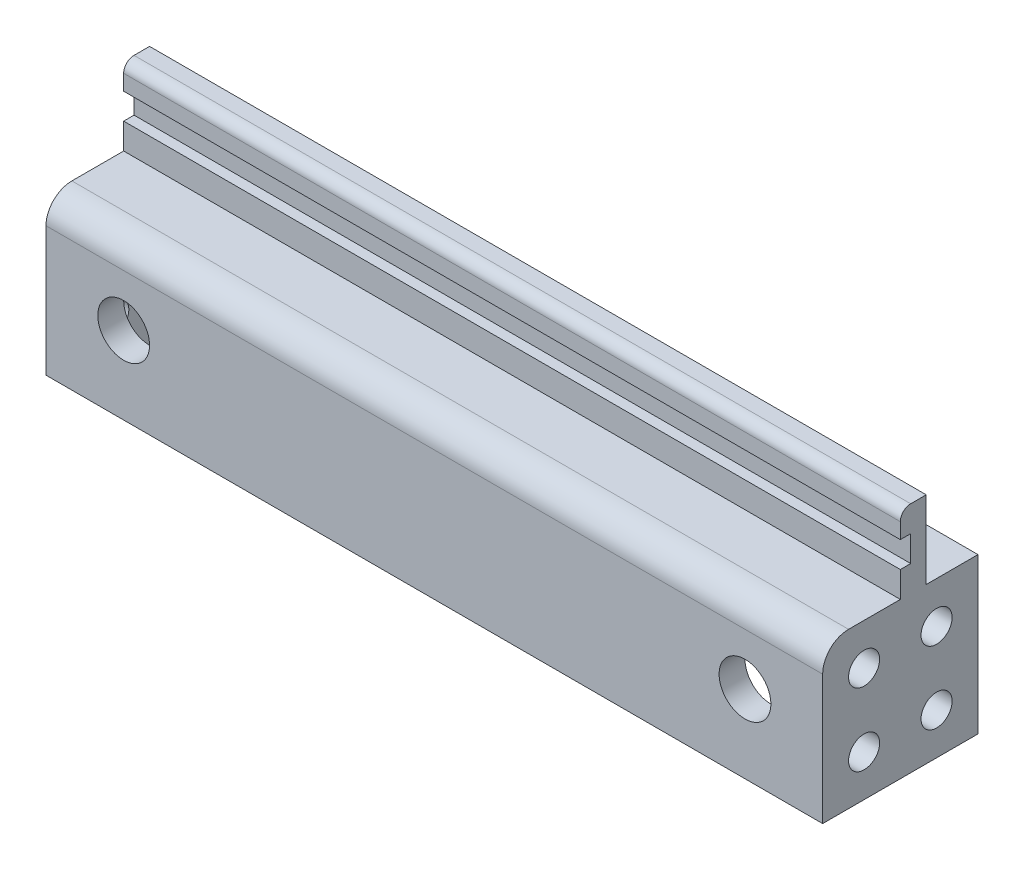
ISO-10303-21;
HEADER;
FILE_DESCRIPTION(('STEP AP214'),'2;1');
FILE_NAME('part.step','',(''),(''),'','','');
FILE_SCHEMA(('AUTOMOTIVE_DESIGN { 1 0 10303 214 1 1 1 1 }'));
ENDSEC;
DATA;
#1=APPLICATION_CONTEXT('core data for automotive mechanical design processes');
#2=APPLICATION_PROTOCOL_DEFINITION('international standard','automotive_design',2000,#1);
#3=PRODUCT_CONTEXT('',#1,'mechanical');
#4=PRODUCT('Part','Part','',(#3));
#5=PRODUCT_RELATED_PRODUCT_CATEGORY('part','',(#4));
#6=PRODUCT_DEFINITION_FORMATION('','',#4);
#7=PRODUCT_DEFINITION_CONTEXT('part definition',#1,'design');
#8=PRODUCT_DEFINITION('design','',#6,#7);
#9=PRODUCT_DEFINITION_SHAPE('','',#8);
#10=(LENGTH_UNIT() NAMED_UNIT(*) SI_UNIT(.MILLI.,.METRE.));
#11=(NAMED_UNIT(*) PLANE_ANGLE_UNIT() SI_UNIT($,.RADIAN.));
#12=(NAMED_UNIT(*) SI_UNIT($,.STERADIAN.) SOLID_ANGLE_UNIT());
#13=UNCERTAINTY_MEASURE_WITH_UNIT(LENGTH_MEASURE(1.E-05),#10,'distance_accuracy_value','');
#14=(GEOMETRIC_REPRESENTATION_CONTEXT(3) GLOBAL_UNCERTAINTY_ASSIGNED_CONTEXT((#13)) GLOBAL_UNIT_ASSIGNED_CONTEXT((#10,
#11,#12)) REPRESENTATION_CONTEXT('',''));
#15=CARTESIAN_POINT('',(0.,0.,0.));
#16=DIRECTION('',(0.,0.,1.));
#17=DIRECTION('',(1.,0.,0.));
#18=AXIS2_PLACEMENT_3D('',#15,#16,#17);
#19=CARTESIAN_POINT('',(-150.,45.,-15.));
#20=DIRECTION('',(0.,0.,-1.));
#21=DIRECTION('',(-1.,0.,0.));
#22=AXIS2_PLACEMENT_3D('',#19,#20,#21);
#23=PLANE('',#22);
#24=DIRECTION('',(0.,-1.,0.));
#25=VECTOR('',#24,1.);
#26=CARTESIAN_POINT('',(0.,45.,-15.));
#27=LINE('',#26,#25);
#28=CARTESIAN_POINT('',(0.,43.,-15.));
#29=VERTEX_POINT('',#28);
#30=CARTESIAN_POINT('',(0.,40.,-15.));
#31=VERTEX_POINT('',#30);
#32=EDGE_CURVE('E262',#29,#31,#27,.T.);
#33=ORIENTED_EDGE('',*,*,#32,.F.);
#34=DIRECTION('',(1.,0.,0.));
#35=VECTOR('',#34,1.);
#36=CARTESIAN_POINT('',(-150.,43.,-15.));
#37=LINE('',#36,#35);
#38=CARTESIAN_POINT('',(-150.,43.,-15.));
#39=VERTEX_POINT('',#38);
#40=EDGE_CURVE('E414',#29,#39,#37,.F.);
#41=ORIENTED_EDGE('',*,*,#40,.T.);
#42=DIRECTION('',(0.,-1.,0.));
#43=VECTOR('',#42,1.);
#44=CARTESIAN_POINT('',(-150.,45.,-15.));
#45=LINE('',#44,#43);
#46=CARTESIAN_POINT('',(-150.,40.,-15.));
#47=VERTEX_POINT('',#46);
#48=EDGE_CURVE('E264',#39,#47,#45,.T.);
#49=ORIENTED_EDGE('',*,*,#48,.T.);
#50=DIRECTION('',(-1.,0.,0.));
#51=VECTOR('',#50,1.);
#52=CARTESIAN_POINT('',(-150.,40.,-15.));
#53=LINE('',#52,#51);
#54=EDGE_CURVE('E229',#31,#47,#53,.T.);
#55=ORIENTED_EDGE('',*,*,#54,.F.);
#56=EDGE_LOOP('',(#33,#41,#49,#55));
#57=FACE_BOUND('',#56,.T.);
#58=ADVANCED_FACE('F51',(#57),#23,.F.);
#59=CARTESIAN_POINT('',(0.,30.,0.));
#60=DIRECTION('',(0.,-1.,0.));
#61=DIRECTION('',(0.,0.,-1.));
#62=AXIS2_PLACEMENT_3D('',#59,#60,#61);
#63=PLANE('',#62);
#64=DIRECTION('',(-1.,0.,0.));
#65=VECTOR('',#64,1.);
#66=CARTESIAN_POINT('',(-150.,30.,-20.));
#67=LINE('',#66,#65);
#68=CARTESIAN_POINT('',(0.,30.,-20.));
#69=VERTEX_POINT('',#68);
#70=CARTESIAN_POINT('',(-150.,30.,-20.));
#71=VERTEX_POINT('',#70);
#72=EDGE_CURVE('E245',#69,#71,#67,.T.);
#73=ORIENTED_EDGE('',*,*,#72,.F.);
#74=DIRECTION('',(0.,0.,-1.));
#75=VECTOR('',#74,1.);
#76=CARTESIAN_POINT('',(0.,30.,-30.));
#77=LINE('',#76,#75);
#78=CARTESIAN_POINT('',(0.,30.,-30.));
#79=VERTEX_POINT('',#78);
#80=EDGE_CURVE('E379',#69,#79,#77,.T.);
#81=ORIENTED_EDGE('',*,*,#80,.T.);
#82=DIRECTION('',(-1.,0.,0.));
#83=VECTOR('',#82,1.);
#84=CARTESIAN_POINT('',(-150.,30.,-30.));
#85=LINE('',#84,#83);
#86=CARTESIAN_POINT('',(-150.,30.,-30.));
#87=VERTEX_POINT('',#86);
#88=EDGE_CURVE('E378',#79,#87,#85,.T.);
#89=ORIENTED_EDGE('',*,*,#88,.T.);
#90=DIRECTION('',(0.,0.,1.));
#91=VECTOR('',#90,1.);
#92=CARTESIAN_POINT('',(-150.,30.,0.));
#93=LINE('',#92,#91);
#94=EDGE_CURVE('E382',#87,#71,#93,.T.);
#95=ORIENTED_EDGE('',*,*,#94,.T.);
#96=EDGE_LOOP('',(#73,#81,#89,#95));
#97=FACE_BOUND('',#96,.T.);
#98=ADVANCED_FACE('F441',(#97),#63,.F.);
#99=CARTESIAN_POINT('',(-150.,30.,-15.));
#100=VERTEX_POINT('',#99);
#101=CARTESIAN_POINT('',(-150.,30.,-5.));
#102=VERTEX_POINT('',#101);
#103=EDGE_CURVE('E381',#100,#102,#93,.T.);
#104=ORIENTED_EDGE('',*,*,#103,.T.);
#105=DIRECTION('',(1.,0.,0.));
#106=VECTOR('',#105,1.);
#107=CARTESIAN_POINT('',(0.,30.,-5.));
#108=LINE('',#107,#106);
#109=CARTESIAN_POINT('',(0.,30.,-5.));
#110=VERTEX_POINT('',#109);
#111=EDGE_CURVE('E418',#102,#110,#108,.T.);
#112=ORIENTED_EDGE('',*,*,#111,.T.);
#113=CARTESIAN_POINT('',(0.,30.,-15.));
#114=VERTEX_POINT('',#113);
#115=EDGE_CURVE('E376',#110,#114,#77,.T.);
#116=ORIENTED_EDGE('',*,*,#115,.T.);
#117=DIRECTION('',(1.,0.,0.));
#118=VECTOR('',#117,1.);
#119=CARTESIAN_POINT('',(-150.,30.,-15.));
#120=LINE('',#119,#118);
#121=EDGE_CURVE('E250',#100,#114,#120,.T.);
#122=ORIENTED_EDGE('',*,*,#121,.F.);
#123=EDGE_LOOP('',(#104,#112,#116,#122));
#124=FACE_BOUND('',#123,.T.);
#125=ADVANCED_FACE('F424',(#124),#63,.F.);
#126=CARTESIAN_POINT('',(-5.,30.,-30.));
#127=DIRECTION('',(-1.,0.,0.));
#128=DIRECTION('',(0.,0.,1.));
#129=AXIS2_PLACEMENT_3D('',#126,#127,#128);
#130=PLANE('',#129);
#131=CARTESIAN_POINT('',(-5.,22.,-8.));
#132=DIRECTION('',(-1.,0.,0.));
#133=DIRECTION('',(0.,0.,1.));
#134=AXIS2_PLACEMENT_3D('',#131,#132,#133);
#135=CIRCLE('',#134,3.);
#136=CARTESIAN_POINT('',(-5.,22.,-5.));
#137=VERTEX_POINT('',#136);
#138=CARTESIAN_POINT('',(-5.,25.,-8.));
#139=VERTEX_POINT('',#138);
#140=EDGE_CURVE('E312',#137,#139,#135,.T.);
#141=ORIENTED_EDGE('',*,*,#140,.F.);
#142=DIRECTION('',(0.,-1.,0.));
#143=VECTOR('',#142,1.);
#144=CARTESIAN_POINT('',(-5.,30.,-5.));
#145=LINE('',#144,#143);
#146=CARTESIAN_POINT('',(-5.,25.,-5.));
#147=VERTEX_POINT('',#146);
#148=EDGE_CURVE('E342',#147,#137,#145,.T.);
#149=ORIENTED_EDGE('',*,*,#148,.F.);
#150=DIRECTION('',(0.,0.,-1.));
#151=VECTOR('',#150,1.);
#152=CARTESIAN_POINT('',(-5.,25.,0.));
#153=LINE('',#152,#151);
#154=EDGE_CURVE('E336',#147,#139,#153,.T.);
#155=ORIENTED_EDGE('',*,*,#154,.T.);
#156=EDGE_LOOP('',(#141,#149,#155));
#157=FACE_BOUND('',#156,.T.);
#158=ADVANCED_FACE('F551',(#157),#130,.T.);
#159=CARTESIAN_POINT('',(-5.,22.,-22.));
#160=DIRECTION('',(-1.,0.,0.));
#161=DIRECTION('',(0.,0.,1.));
#162=AXIS2_PLACEMENT_3D('',#159,#160,#161);
#163=CIRCLE('',#162,3.);
#164=CARTESIAN_POINT('',(-5.,25.,-22.));
#165=VERTEX_POINT('',#164);
#166=CARTESIAN_POINT('',(-5.,22.,-25.));
#167=VERTEX_POINT('',#166);
#168=EDGE_CURVE('E303',#165,#167,#163,.T.);
#169=ORIENTED_EDGE('',*,*,#168,.F.);
#170=CARTESIAN_POINT('',(-5.,25.,-25.));
#171=VERTEX_POINT('',#170);
#172=EDGE_CURVE('E341',#165,#171,#153,.T.);
#173=ORIENTED_EDGE('',*,*,#172,.T.);
#174=DIRECTION('',(0.,-1.,0.));
#175=VECTOR('',#174,1.);
#176=CARTESIAN_POINT('',(-5.,30.,-25.));
#177=LINE('',#176,#175);
#178=EDGE_CURVE('E330',#171,#167,#177,.T.);
#179=ORIENTED_EDGE('',*,*,#178,.T.);
#180=EDGE_LOOP('',(#169,#173,#179));
#181=FACE_BOUND('',#180,.T.);
#182=ADVANCED_FACE('F587',(#181),#130,.T.);
#183=CARTESIAN_POINT('',(-145.,30.,0.));
#184=DIRECTION('',(1.,0.,0.));
#185=DIRECTION('',(0.,0.,-1.));
#186=AXIS2_PLACEMENT_3D('',#183,#184,#185);
#187=PLANE('',#186);
#188=CARTESIAN_POINT('',(-145.,22.,-8.));
#189=DIRECTION('',(1.,0.,0.));
#190=DIRECTION('',(0.,0.,-1.));
#191=AXIS2_PLACEMENT_3D('',#188,#189,#190);
#192=CIRCLE('',#191,3.);
#193=CARTESIAN_POINT('',(-145.,25.,-8.));
#194=VERTEX_POINT('',#193);
#195=CARTESIAN_POINT('',(-145.,22.,-5.));
#196=VERTEX_POINT('',#195);
#197=EDGE_CURVE('E309',#194,#196,#192,.T.);
#198=ORIENTED_EDGE('',*,*,#197,.F.);
#199=DIRECTION('',(0.,0.,1.));
#200=VECTOR('',#199,1.);
#201=CARTESIAN_POINT('',(-145.,25.,0.));
#202=LINE('',#201,#200);
#203=CARTESIAN_POINT('',(-145.,25.,-5.));
#204=VERTEX_POINT('',#203);
#205=EDGE_CURVE('E354',#194,#204,#202,.T.);
#206=ORIENTED_EDGE('',*,*,#205,.T.);
#207=DIRECTION('',(0.,-1.,0.));
#208=VECTOR('',#207,1.);
#209=CARTESIAN_POINT('',(-145.,30.,-5.));
#210=LINE('',#209,#208);
#211=EDGE_CURVE('E355',#204,#196,#210,.T.);
#212=ORIENTED_EDGE('',*,*,#211,.T.);
#213=EDGE_LOOP('',(#198,#206,#212));
#214=FACE_BOUND('',#213,.T.);
#215=ADVANCED_FACE('F607',(#214),#187,.T.);
#216=CARTESIAN_POINT('',(-145.,22.,-22.));
#217=DIRECTION('',(1.,0.,0.));
#218=DIRECTION('',(0.,0.,-1.));
#219=AXIS2_PLACEMENT_3D('',#216,#217,#218);
#220=CIRCLE('',#219,3.);
#221=CARTESIAN_POINT('',(-145.,22.,-25.));
#222=VERTEX_POINT('',#221);
#223=CARTESIAN_POINT('',(-145.,25.,-22.));
#224=VERTEX_POINT('',#223);
#225=EDGE_CURVE('E300',#222,#224,#220,.T.);
#226=ORIENTED_EDGE('',*,*,#225,.F.);
#227=DIRECTION('',(0.,-1.,0.));
#228=VECTOR('',#227,1.);
#229=CARTESIAN_POINT('',(-145.,30.,-25.));
#230=LINE('',#229,#228);
#231=CARTESIAN_POINT('',(-145.,25.,-25.));
#232=VERTEX_POINT('',#231);
#233=EDGE_CURVE('E348',#232,#222,#230,.T.);
#234=ORIENTED_EDGE('',*,*,#233,.F.);
#235=EDGE_CURVE('E359',#232,#224,#202,.T.);
#236=ORIENTED_EDGE('',*,*,#235,.T.);
#237=EDGE_LOOP('',(#226,#234,#236));
#238=FACE_BOUND('',#237,.T.);
#239=ADVANCED_FACE('F608',(#238),#187,.T.);
#240=CARTESIAN_POINT('',(0.,0.,0.));
#241=DIRECTION('',(0.,-1.,0.));
#242=DIRECTION('',(0.,0.,-1.));
#243=AXIS2_PLACEMENT_3D('',#240,#241,#242);
#244=PLANE('',#243);
#245=DIRECTION('',(0.,0.,-1.));
#246=VECTOR('',#245,1.);
#247=CARTESIAN_POINT('',(0.,0.,-30.));
#248=LINE('',#247,#246);
#249=CARTESIAN_POINT('',(0.,0.,0.));
#250=VERTEX_POINT('',#249);
#251=CARTESIAN_POINT('',(0.,0.,-30.));
#252=VERTEX_POINT('',#251);
#253=EDGE_CURVE('E333',#250,#252,#248,.T.);
#254=ORIENTED_EDGE('',*,*,#253,.F.);
#255=DIRECTION('',(1.,0.,0.));
#256=VECTOR('',#255,1.);
#257=CARTESIAN_POINT('',(0.,0.,0.));
#258=LINE('',#257,#256);
#259=CARTESIAN_POINT('',(-150.,0.,0.));
#260=VERTEX_POINT('',#259);
#261=EDGE_CURVE('E392',#260,#250,#258,.T.);
#262=ORIENTED_EDGE('',*,*,#261,.F.);
#263=DIRECTION('',(0.,0.,1.));
#264=VECTOR('',#263,1.);
#265=CARTESIAN_POINT('',(-150.,0.,0.));
#266=LINE('',#265,#264);
#267=CARTESIAN_POINT('',(-150.,0.,-30.));
#268=VERTEX_POINT('',#267);
#269=EDGE_CURVE('E389',#268,#260,#266,.T.);
#270=ORIENTED_EDGE('',*,*,#269,.F.);
#271=DIRECTION('',(-1.,0.,0.));
#272=VECTOR('',#271,1.);
#273=CARTESIAN_POINT('',(-150.,0.,-30.));
#274=LINE('',#273,#272);
#275=EDGE_CURVE('E387',#252,#268,#274,.T.);
#276=ORIENTED_EDGE('',*,*,#275,.F.);
#277=EDGE_LOOP('',(#254,#262,#270,#276));
#278=FACE_BOUND('',#277,.T.);
#279=DIRECTION('',(1.,0.,0.));
#280=VECTOR('',#279,1.);
#281=CARTESIAN_POINT('',(0.,0.,-5.));
#282=LINE('',#281,#280);
#283=CARTESIAN_POINT('',(-145.,0.,-5.));
#284=VERTEX_POINT('',#283);
#285=CARTESIAN_POINT('',(-5.,0.,-5.));
#286=VERTEX_POINT('',#285);
#287=EDGE_CURVE('E368',#284,#286,#282,.T.);
#288=ORIENTED_EDGE('',*,*,#287,.T.);
#289=DIRECTION('',(0.,0.,-1.));
#290=VECTOR('',#289,1.);
#291=CARTESIAN_POINT('',(-5.,0.,0.));
#292=LINE('',#291,#290);
#293=CARTESIAN_POINT('',(-5.,0.,-25.));
#294=VERTEX_POINT('',#293);
#295=EDGE_CURVE('E329',#286,#294,#292,.T.);
#296=ORIENTED_EDGE('',*,*,#295,.T.);
#297=DIRECTION('',(-1.,0.,0.));
#298=VECTOR('',#297,1.);
#299=CARTESIAN_POINT('',(0.,0.,-25.));
#300=LINE('',#299,#298);
#301=CARTESIAN_POINT('',(-145.,0.,-25.));
#302=VERTEX_POINT('',#301);
#303=EDGE_CURVE('E367',#294,#302,#300,.T.);
#304=ORIENTED_EDGE('',*,*,#303,.T.);
#305=DIRECTION('',(0.,0.,1.));
#306=VECTOR('',#305,1.);
#307=CARTESIAN_POINT('',(-145.,0.,0.));
#308=LINE('',#307,#306);
#309=EDGE_CURVE('E371',#302,#284,#308,.T.);
#310=ORIENTED_EDGE('',*,*,#309,.T.);
#311=EDGE_LOOP('',(#288,#296,#304,#310));
#312=FACE_BOUND('',#311,.T.);
#313=ADVANCED_FACE('F495',(#278,#312),#244,.T.);
#314=CARTESIAN_POINT('',(0.,30.,-30.));
#315=DIRECTION('',(-1.,0.,0.));
#316=DIRECTION('',(0.,0.,1.));
#317=AXIS2_PLACEMENT_3D('',#314,#315,#316);
#318=PLANE('',#317);
#319=ORIENTED_EDGE('',*,*,#115,.F.);
#320=CARTESIAN_POINT('',(0.,25.,-5.));
#321=DIRECTION('',(-1.,0.,0.));
#322=DIRECTION('',(0.,0.,1.));
#323=AXIS2_PLACEMENT_3D('',#320,#321,#322);
#324=CIRCLE('',#323,5.);
#325=CARTESIAN_POINT('',(0.,25.,0.));
#326=VERTEX_POINT('',#325);
#327=EDGE_CURVE('E73',#110,#326,#324,.F.);
#328=ORIENTED_EDGE('',*,*,#327,.T.);
#329=DIRECTION('',(0.,-1.,0.));
#330=VECTOR('',#329,1.);
#331=CARTESIAN_POINT('',(0.,30.,0.));
#332=LINE('',#331,#330);
#333=EDGE_CURVE('E384',#326,#250,#332,.T.);
#334=ORIENTED_EDGE('',*,*,#333,.T.);
#335=ORIENTED_EDGE('',*,*,#253,.T.);
#336=DIRECTION('',(0.,-1.,0.));
#337=VECTOR('',#336,1.);
#338=CARTESIAN_POINT('',(0.,30.,-30.));
#339=LINE('',#338,#337);
#340=EDGE_CURVE('E401',#79,#252,#339,.T.);
#341=ORIENTED_EDGE('',*,*,#340,.F.);
#342=ORIENTED_EDGE('',*,*,#80,.F.);
#343=DIRECTION('',(0.,-1.,0.));
#344=VECTOR('',#343,1.);
#345=CARTESIAN_POINT('',(0.,45.,-20.));
#346=LINE('',#345,#344);
#347=CARTESIAN_POINT('',(0.,45.,-20.));
#348=VERTEX_POINT('',#347);
#349=EDGE_CURVE('E258',#348,#69,#346,.T.);
#350=ORIENTED_EDGE('',*,*,#349,.F.);
#351=DIRECTION('',(0.,0.,-1.));
#352=VECTOR('',#351,1.);
#353=CARTESIAN_POINT('',(0.,45.,-20.));
#354=LINE('',#353,#352);
#355=CARTESIAN_POINT('',(0.,45.,-17.));
#356=VERTEX_POINT('',#355);
#357=EDGE_CURVE('E244',#356,#348,#354,.T.);
#358=ORIENTED_EDGE('',*,*,#357,.F.);
#359=CARTESIAN_POINT('',(0.,43.,-17.));
#360=DIRECTION('',(-1.,0.,0.));
#361=DIRECTION('',(0.,0.,1.));
#362=AXIS2_PLACEMENT_3D('',#359,#360,#361);
#363=CIRCLE('',#362,2.);
#364=EDGE_CURVE('E412',#356,#29,#363,.F.);
#365=ORIENTED_EDGE('',*,*,#364,.T.);
#366=ORIENTED_EDGE('',*,*,#32,.T.);
#367=DIRECTION('',(0.,0.,1.));
#368=VECTOR('',#367,1.);
#369=CARTESIAN_POINT('',(0.,40.,-17.));
#370=LINE('',#369,#368);
#371=CARTESIAN_POINT('',(0.,40.,-17.));
#372=VERTEX_POINT('',#371);
#373=EDGE_CURVE('E236',#372,#31,#370,.T.);
#374=ORIENTED_EDGE('',*,*,#373,.F.);
#375=DIRECTION('',(0.,1.,0.));
#376=VECTOR('',#375,1.);
#377=CARTESIAN_POINT('',(0.,40.,-17.));
#378=LINE('',#377,#376);
#379=CARTESIAN_POINT('',(0.,35.,-17.));
#380=VERTEX_POINT('',#379);
#381=EDGE_CURVE('E219',#380,#372,#378,.T.);
#382=ORIENTED_EDGE('',*,*,#381,.F.);
#383=DIRECTION('',(0.,0.,1.));
#384=VECTOR('',#383,1.);
#385=CARTESIAN_POINT('',(0.,35.,-17.));
#386=LINE('',#385,#384);
#387=CARTESIAN_POINT('',(0.,35.,-15.));
#388=VERTEX_POINT('',#387);
#389=EDGE_CURVE('E216',#380,#388,#386,.T.);
#390=ORIENTED_EDGE('',*,*,#389,.T.);
#391=EDGE_CURVE('E261',#388,#114,#27,.T.);
#392=ORIENTED_EDGE('',*,*,#391,.T.);
#393=EDGE_LOOP('',(#319,#328,#334,#335,#341,#342,#350,#358,#365,#366,#374,#382,#390,#392));
#394=FACE_BOUND('',#393,.T.);
#395=CARTESIAN_POINT('',(0.,8.,-22.));
#396=DIRECTION('',(-1.,0.,0.));
#397=DIRECTION('',(0.,0.,1.));
#398=AXIS2_PLACEMENT_3D('',#395,#396,#397);
#399=CIRCLE('',#398,3.);
#400=CARTESIAN_POINT('',(0.,8.,-19.));
#401=VERTEX_POINT('',#400);
#402=EDGE_CURVE('E286',#401,#401,#399,.T.);
#403=ORIENTED_EDGE('',*,*,#402,.T.);
#404=EDGE_LOOP('',(#403));
#405=FACE_BOUND('',#404,.T.);
#406=CARTESIAN_POINT('',(0.,8.,-8.));
#407=DIRECTION('',(-1.,0.,0.));
#408=DIRECTION('',(0.,0.,1.));
#409=AXIS2_PLACEMENT_3D('',#406,#407,#408);
#410=CIRCLE('',#409,3.);
#411=CARTESIAN_POINT('',(0.,8.,-5.));
#412=VERTEX_POINT('',#411);
#413=EDGE_CURVE('E291',#412,#412,#410,.T.);
#414=ORIENTED_EDGE('',*,*,#413,.T.);
#415=EDGE_LOOP('',(#414));
#416=FACE_BOUND('',#415,.T.);
#417=CARTESIAN_POINT('',(0.,22.,-8.));
#418=DIRECTION('',(-1.,0.,0.));
#419=DIRECTION('',(0.,0.,1.));
#420=AXIS2_PLACEMENT_3D('',#417,#418,#419);
#421=CIRCLE('',#420,3.);
#422=CARTESIAN_POINT('',(0.,22.,-5.));
#423=VERTEX_POINT('',#422);
#424=EDGE_CURVE('E287',#423,#423,#421,.T.);
#425=ORIENTED_EDGE('',*,*,#424,.T.);
#426=EDGE_LOOP('',(#425));
#427=FACE_BOUND('',#426,.T.);
#428=CARTESIAN_POINT('',(0.,22.,-22.));
#429=DIRECTION('',(-1.,0.,0.));
#430=DIRECTION('',(0.,0.,1.));
#431=AXIS2_PLACEMENT_3D('',#428,#429,#430);
#432=CIRCLE('',#431,3.);
#433=CARTESIAN_POINT('',(0.,22.,-19.));
#434=VERTEX_POINT('',#433);
#435=EDGE_CURVE('E290',#434,#434,#432,.T.);
#436=ORIENTED_EDGE('',*,*,#435,.T.);
#437=EDGE_LOOP('',(#436));
#438=FACE_BOUND('',#437,.T.);
#439=ADVANCED_FACE('F429',(#394,#405,#416,#427,#438),#318,.F.);
#440=CARTESIAN_POINT('',(-150.,30.,-30.));
#441=DIRECTION('',(0.,0.,1.));
#442=DIRECTION('',(1.,0.,0.));
#443=AXIS2_PLACEMENT_3D('',#440,#441,#442);
#444=PLANE('',#443);
#445=CARTESIAN_POINT('',(-135.,15.,-30.));
#446=DIRECTION('',(0.,0.,1.));
#447=DIRECTION('',(1.,0.,0.));
#448=AXIS2_PLACEMENT_3D('',#445,#446,#447);
#449=CIRCLE('',#448,4.99999999999999);
#450=CARTESIAN_POINT('',(-130.,15.,-30.));
#451=VERTEX_POINT('',#450);
#452=EDGE_CURVE('E267',#451,#451,#449,.T.);
#453=ORIENTED_EDGE('',*,*,#452,.T.);
#454=EDGE_LOOP('',(#453));
#455=FACE_BOUND('',#454,.T.);
#456=CARTESIAN_POINT('',(-15.,15.,-30.));
#457=DIRECTION('',(0.,0.,1.));
#458=DIRECTION('',(1.,0.,0.));
#459=AXIS2_PLACEMENT_3D('',#456,#457,#458);
#460=CIRCLE('',#459,5.);
#461=CARTESIAN_POINT('',(-10.,15.,-30.));
#462=VERTEX_POINT('',#461);
#463=EDGE_CURVE('E266',#462,#462,#460,.T.);
#464=ORIENTED_EDGE('',*,*,#463,.T.);
#465=EDGE_LOOP('',(#464));
#466=FACE_BOUND('',#465,.T.);
#467=ORIENTED_EDGE('',*,*,#275,.T.);
#468=DIRECTION('',(0.,-1.,0.));
#469=VECTOR('',#468,1.);
#470=CARTESIAN_POINT('',(-150.,30.,-30.));
#471=LINE('',#470,#469);
#472=EDGE_CURVE('E398',#87,#268,#471,.T.);
#473=ORIENTED_EDGE('',*,*,#472,.F.);
#474=ORIENTED_EDGE('',*,*,#88,.F.);
#475=ORIENTED_EDGE('',*,*,#340,.T.);
#476=EDGE_LOOP('',(#467,#473,#474,#475));
#477=FACE_BOUND('',#476,.T.);
#478=ADVANCED_FACE('F501',(#455,#466,#477),#444,.F.);
#479=CARTESIAN_POINT('',(-150.,30.,0.));
#480=DIRECTION('',(1.,0.,0.));
#481=DIRECTION('',(0.,0.,-1.));
#482=AXIS2_PLACEMENT_3D('',#479,#480,#481);
#483=PLANE('',#482);
#484=CARTESIAN_POINT('',(-150.,8.,-22.));
#485=DIRECTION('',(1.,0.,0.));
#486=DIRECTION('',(0.,0.,-1.));
#487=AXIS2_PLACEMENT_3D('',#484,#485,#486);
#488=CIRCLE('',#487,3.);
#489=CARTESIAN_POINT('',(-150.,8.,-25.));
#490=VERTEX_POINT('',#489);
#491=EDGE_CURVE('E326',#490,#490,#488,.T.);
#492=ORIENTED_EDGE('',*,*,#491,.T.);
#493=EDGE_LOOP('',(#492));
#494=FACE_BOUND('',#493,.T.);
#495=CARTESIAN_POINT('',(-150.,8.,-8.));
#496=DIRECTION('',(1.,0.,0.));
#497=DIRECTION('',(0.,0.,-1.));
#498=AXIS2_PLACEMENT_3D('',#495,#496,#497);
#499=CIRCLE('',#498,3.);
#500=CARTESIAN_POINT('',(-150.,8.,-11.));
#501=VERTEX_POINT('',#500);
#502=EDGE_CURVE('E320',#501,#501,#499,.T.);
#503=ORIENTED_EDGE('',*,*,#502,.T.);
#504=EDGE_LOOP('',(#503));
#505=FACE_BOUND('',#504,.T.);
#506=CARTESIAN_POINT('',(-150.,22.,-8.));
#507=DIRECTION('',(1.,0.,0.));
#508=DIRECTION('',(0.,0.,-1.));
#509=AXIS2_PLACEMENT_3D('',#506,#507,#508);
#510=CIRCLE('',#509,3.);
#511=CARTESIAN_POINT('',(-150.,22.,-11.));
#512=VERTEX_POINT('',#511);
#513=EDGE_CURVE('E313',#512,#512,#510,.T.);
#514=ORIENTED_EDGE('',*,*,#513,.T.);
#515=EDGE_LOOP('',(#514));
#516=FACE_BOUND('',#515,.T.);
#517=CARTESIAN_POINT('',(-150.,22.,-22.));
#518=DIRECTION('',(1.,0.,0.));
#519=DIRECTION('',(0.,0.,-1.));
#520=AXIS2_PLACEMENT_3D('',#517,#518,#519);
#521=CIRCLE('',#520,3.);
#522=CARTESIAN_POINT('',(-150.,22.,-25.));
#523=VERTEX_POINT('',#522);
#524=EDGE_CURVE('E304',#523,#523,#521,.T.);
#525=ORIENTED_EDGE('',*,*,#524,.T.);
#526=EDGE_LOOP('',(#525));
#527=FACE_BOUND('',#526,.T.);
#528=DIRECTION('',(0.,-1.,0.));
#529=VECTOR('',#528,1.);
#530=CARTESIAN_POINT('',(-150.,30.,0.));
#531=LINE('',#530,#529);
#532=CARTESIAN_POINT('',(-150.,25.,0.));
#533=VERTEX_POINT('',#532);
#534=EDGE_CURVE('E396',#533,#260,#531,.T.);
#535=ORIENTED_EDGE('',*,*,#534,.F.);
#536=CARTESIAN_POINT('',(-150.,25.,-5.));
#537=DIRECTION('',(1.,0.,0.));
#538=DIRECTION('',(0.,0.,-1.));
#539=AXIS2_PLACEMENT_3D('',#536,#537,#538);
#540=CIRCLE('',#539,5.);
#541=EDGE_CURVE('E13',#533,#102,#540,.F.);
#542=ORIENTED_EDGE('',*,*,#541,.T.);
#543=ORIENTED_EDGE('',*,*,#103,.F.);
#544=CARTESIAN_POINT('',(-150.,35.,-15.));
#545=VERTEX_POINT('',#544);
#546=EDGE_CURVE('E234',#545,#100,#45,.T.);
#547=ORIENTED_EDGE('',*,*,#546,.F.);
#548=DIRECTION('',(0.,0.,1.));
#549=VECTOR('',#548,1.);
#550=CARTESIAN_POINT('',(-150.,35.,-17.));
#551=LINE('',#550,#549);
#552=CARTESIAN_POINT('',(-150.,35.,-17.));
#553=VERTEX_POINT('',#552);
#554=EDGE_CURVE('E213',#553,#545,#551,.T.);
#555=ORIENTED_EDGE('',*,*,#554,.F.);
#556=DIRECTION('',(0.,-1.,0.));
#557=VECTOR('',#556,1.);
#558=CARTESIAN_POINT('',(-150.,40.,-17.));
#559=LINE('',#558,#557);
#560=CARTESIAN_POINT('',(-150.,40.,-17.));
#561=VERTEX_POINT('',#560);
#562=EDGE_CURVE('E220',#561,#553,#559,.T.);
#563=ORIENTED_EDGE('',*,*,#562,.F.);
#564=DIRECTION('',(0.,0.,1.));
#565=VECTOR('',#564,1.);
#566=CARTESIAN_POINT('',(-150.,40.,-17.));
#567=LINE('',#566,#565);
#568=EDGE_CURVE('E253',#561,#47,#567,.T.);
#569=ORIENTED_EDGE('',*,*,#568,.T.);
#570=ORIENTED_EDGE('',*,*,#48,.F.);
#571=CARTESIAN_POINT('',(-150.,43.,-17.));
#572=DIRECTION('',(1.,0.,0.));
#573=DIRECTION('',(0.,0.,-1.));
#574=AXIS2_PLACEMENT_3D('',#571,#572,#573);
#575=CIRCLE('',#574,2.);
#576=CARTESIAN_POINT('',(-150.,45.,-17.));
#577=VERTEX_POINT('',#576);
#578=EDGE_CURVE('E416',#39,#577,#575,.F.);
#579=ORIENTED_EDGE('',*,*,#578,.T.);
#580=DIRECTION('',(0.,0.,1.));
#581=VECTOR('',#580,1.);
#582=CARTESIAN_POINT('',(-150.,45.,-20.));
#583=LINE('',#582,#581);
#584=CARTESIAN_POINT('',(-150.,45.,-20.));
#585=VERTEX_POINT('',#584);
#586=EDGE_CURVE('E241',#585,#577,#583,.T.);
#587=ORIENTED_EDGE('',*,*,#586,.F.);
#588=DIRECTION('',(0.,-1.,0.));
#589=VECTOR('',#588,1.);
#590=CARTESIAN_POINT('',(-150.,45.,-20.));
#591=LINE('',#590,#589);
#592=EDGE_CURVE('E249',#585,#71,#591,.T.);
#593=ORIENTED_EDGE('',*,*,#592,.T.);
#594=ORIENTED_EDGE('',*,*,#94,.F.);
#595=ORIENTED_EDGE('',*,*,#472,.T.);
#596=ORIENTED_EDGE('',*,*,#269,.T.);
#597=EDGE_LOOP('',(#535,#542,#543,#547,#555,#563,#569,#570,#579,#587,#593,#594,#595,#596));
#598=FACE_BOUND('',#597,.T.);
#599=ADVANCED_FACE('F232',(#494,#505,#516,#527,#598),#483,.F.);
#600=CARTESIAN_POINT('',(0.,30.,0.));
#601=DIRECTION('',(0.,0.,-1.));
#602=DIRECTION('',(-1.,0.,0.));
#603=AXIS2_PLACEMENT_3D('',#600,#601,#602);
#604=PLANE('',#603);
#605=CARTESIAN_POINT('',(-135.,15.,0.));
#606=DIRECTION('',(0.,0.,-1.));
#607=DIRECTION('',(-1.,0.,0.));
#608=AXIS2_PLACEMENT_3D('',#605,#606,#607);
#609=CIRCLE('',#608,4.99999999999999);
#610=CARTESIAN_POINT('',(-140.,15.,0.));
#611=VERTEX_POINT('',#610);
#612=EDGE_CURVE('E283',#611,#611,#609,.T.);
#613=ORIENTED_EDGE('',*,*,#612,.T.);
#614=EDGE_LOOP('',(#613));
#615=FACE_BOUND('',#614,.T.);
#616=CARTESIAN_POINT('',(-15.,15.,0.));
#617=DIRECTION('',(0.,0.,-1.));
#618=DIRECTION('',(-1.,0.,0.));
#619=AXIS2_PLACEMENT_3D('',#616,#617,#618);
#620=CIRCLE('',#619,5.);
#621=CARTESIAN_POINT('',(-20.,15.,0.));
#622=VERTEX_POINT('',#621);
#623=EDGE_CURVE('E276',#622,#622,#620,.T.);
#624=ORIENTED_EDGE('',*,*,#623,.T.);
#625=EDGE_LOOP('',(#624));
#626=FACE_BOUND('',#625,.T.);
#627=ORIENTED_EDGE('',*,*,#333,.F.);
#628=DIRECTION('',(1.,0.,0.));
#629=VECTOR('',#628,1.);
#630=CARTESIAN_POINT('',(0.,25.,0.));
#631=LINE('',#630,#629);
#632=EDGE_CURVE('E59',#326,#533,#631,.F.);
#633=ORIENTED_EDGE('',*,*,#632,.T.);
#634=ORIENTED_EDGE('',*,*,#534,.T.);
#635=ORIENTED_EDGE('',*,*,#261,.T.);
#636=EDGE_LOOP('',(#627,#633,#634,#635));
#637=FACE_BOUND('',#636,.T.);
#638=ADVANCED_FACE('F484',(#615,#626,#637),#604,.F.);
#639=CARTESIAN_POINT('',(-5.,8.,-25.));
#640=VERTEX_POINT('',#639);
#641=EDGE_CURVE('E334',#167,#640,#177,.T.);
#642=ORIENTED_EDGE('',*,*,#641,.T.);
#643=CARTESIAN_POINT('',(-5.,8.,-22.));
#644=DIRECTION('',(-1.,0.,0.));
#645=DIRECTION('',(0.,0.,1.));
#646=AXIS2_PLACEMENT_3D('',#643,#644,#645);
#647=CIRCLE('',#646,3.);
#648=EDGE_CURVE('E324',#640,#640,#647,.T.);
#649=ORIENTED_EDGE('',*,*,#648,.F.);
#650=EDGE_CURVE('E335',#640,#294,#177,.T.);
#651=ORIENTED_EDGE('',*,*,#650,.T.);
#652=ORIENTED_EDGE('',*,*,#295,.F.);
#653=CARTESIAN_POINT('',(-5.,8.,-5.));
#654=VERTEX_POINT('',#653);
#655=EDGE_CURVE('E347',#654,#286,#145,.T.);
#656=ORIENTED_EDGE('',*,*,#655,.F.);
#657=CARTESIAN_POINT('',(-5.,8.,-8.));
#658=DIRECTION('',(-1.,0.,0.));
#659=DIRECTION('',(0.,0.,1.));
#660=AXIS2_PLACEMENT_3D('',#657,#658,#659);
#661=CIRCLE('',#660,3.);
#662=EDGE_CURVE('E318',#654,#654,#661,.T.);
#663=ORIENTED_EDGE('',*,*,#662,.F.);
#664=EDGE_CURVE('E346',#137,#654,#145,.T.);
#665=ORIENTED_EDGE('',*,*,#664,.F.);
#666=EDGE_CURVE('E310',#139,#137,#135,.T.);
#667=ORIENTED_EDGE('',*,*,#666,.F.);
#668=EDGE_CURVE('E340',#139,#165,#153,.T.);
#669=ORIENTED_EDGE('',*,*,#668,.T.);
#670=EDGE_CURVE('E301',#167,#165,#163,.T.);
#671=ORIENTED_EDGE('',*,*,#670,.F.);
#672=EDGE_LOOP('',(#642,#649,#651,#652,#656,#663,#665,#667,#669,#671));
#673=FACE_BOUND('',#672,.T.);
#674=ADVANCED_FACE('F487',(#673),#130,.T.);
#675=CARTESIAN_POINT('',(-150.,30.,-25.));
#676=DIRECTION('',(0.,0.,1.));
#677=DIRECTION('',(1.,0.,0.));
#678=AXIS2_PLACEMENT_3D('',#675,#676,#677);
#679=PLANE('',#678);
#680=CARTESIAN_POINT('',(-135.,15.,-25.));
#681=DIRECTION('',(0.,0.,1.));
#682=DIRECTION('',(1.,0.,0.));
#683=AXIS2_PLACEMENT_3D('',#680,#681,#682);
#684=CIRCLE('',#683,4.99999999999999);
#685=CARTESIAN_POINT('',(-130.,15.,-25.));
#686=VERTEX_POINT('',#685);
#687=EDGE_CURVE('E280',#686,#686,#684,.T.);
#688=ORIENTED_EDGE('',*,*,#687,.F.);
#689=EDGE_LOOP('',(#688));
#690=FACE_BOUND('',#689,.T.);
#691=CARTESIAN_POINT('',(-15.,15.,-25.));
#692=DIRECTION('',(0.,0.,1.));
#693=DIRECTION('',(1.,0.,0.));
#694=AXIS2_PLACEMENT_3D('',#691,#692,#693);
#695=CIRCLE('',#694,5.);
#696=CARTESIAN_POINT('',(-10.,15.,-25.));
#697=VERTEX_POINT('',#696);
#698=EDGE_CURVE('E273',#697,#697,#695,.T.);
#699=ORIENTED_EDGE('',*,*,#698,.F.);
#700=EDGE_LOOP('',(#699));
#701=FACE_BOUND('',#700,.T.);
#702=ORIENTED_EDGE('',*,*,#233,.T.);
#703=CARTESIAN_POINT('',(-145.,8.,-25.));
#704=VERTEX_POINT('',#703);
#705=EDGE_CURVE('E351',#222,#704,#230,.T.);
#706=ORIENTED_EDGE('',*,*,#705,.T.);
#707=EDGE_CURVE('E352',#704,#302,#230,.T.);
#708=ORIENTED_EDGE('',*,*,#707,.T.);
#709=ORIENTED_EDGE('',*,*,#303,.F.);
#710=ORIENTED_EDGE('',*,*,#650,.F.);
#711=ORIENTED_EDGE('',*,*,#641,.F.);
#712=ORIENTED_EDGE('',*,*,#178,.F.);
#713=DIRECTION('',(-1.,0.,0.));
#714=VECTOR('',#713,1.);
#715=CARTESIAN_POINT('',(0.,25.,-25.));
#716=LINE('',#715,#714);
#717=EDGE_CURVE('E339',#171,#232,#716,.T.);
#718=ORIENTED_EDGE('',*,*,#717,.T.);
#719=EDGE_LOOP('',(#702,#706,#708,#709,#710,#711,#712,#718));
#720=FACE_BOUND('',#719,.T.);
#721=ADVANCED_FACE('F584',(#690,#701,#720),#679,.T.);
#722=ORIENTED_EDGE('',*,*,#707,.F.);
#723=CARTESIAN_POINT('',(-145.,8.,-22.));
#724=DIRECTION('',(1.,0.,0.));
#725=DIRECTION('',(0.,0.,-1.));
#726=AXIS2_PLACEMENT_3D('',#723,#724,#725);
#727=CIRCLE('',#726,3.);
#728=EDGE_CURVE('E323',#704,#704,#727,.T.);
#729=ORIENTED_EDGE('',*,*,#728,.F.);
#730=ORIENTED_EDGE('',*,*,#705,.F.);
#731=EDGE_CURVE('E298',#224,#222,#220,.T.);
#732=ORIENTED_EDGE('',*,*,#731,.F.);
#733=EDGE_CURVE('E363',#224,#194,#202,.T.);
#734=ORIENTED_EDGE('',*,*,#733,.T.);
#735=EDGE_CURVE('E307',#196,#194,#192,.T.);
#736=ORIENTED_EDGE('',*,*,#735,.F.);
#737=CARTESIAN_POINT('',(-145.,8.,-5.));
#738=VERTEX_POINT('',#737);
#739=EDGE_CURVE('E358',#196,#738,#210,.T.);
#740=ORIENTED_EDGE('',*,*,#739,.T.);
#741=CARTESIAN_POINT('',(-145.,8.,-8.));
#742=DIRECTION('',(1.,0.,0.));
#743=DIRECTION('',(0.,0.,-1.));
#744=AXIS2_PLACEMENT_3D('',#741,#742,#743);
#745=CIRCLE('',#744,3.);
#746=EDGE_CURVE('E316',#738,#738,#745,.T.);
#747=ORIENTED_EDGE('',*,*,#746,.F.);
#748=EDGE_CURVE('E345',#738,#284,#210,.T.);
#749=ORIENTED_EDGE('',*,*,#748,.T.);
#750=ORIENTED_EDGE('',*,*,#309,.F.);
#751=EDGE_LOOP('',(#722,#729,#730,#732,#734,#736,#740,#747,#749,#750));
#752=FACE_BOUND('',#751,.T.);
#753=ADVANCED_FACE('F595',(#752),#187,.T.);
#754=CARTESIAN_POINT('',(0.,30.,-5.));
#755=DIRECTION('',(0.,0.,-1.));
#756=DIRECTION('',(-1.,0.,0.));
#757=AXIS2_PLACEMENT_3D('',#754,#755,#756);
#758=PLANE('',#757);
#759=CARTESIAN_POINT('',(-135.,15.,-5.));
#760=DIRECTION('',(0.,0.,-1.));
#761=DIRECTION('',(-1.,0.,0.));
#762=AXIS2_PLACEMENT_3D('',#759,#760,#761);
#763=CIRCLE('',#762,4.99999999999999);
#764=CARTESIAN_POINT('',(-140.,15.,-5.));
#765=VERTEX_POINT('',#764);
#766=EDGE_CURVE('E279',#765,#765,#763,.T.);
#767=ORIENTED_EDGE('',*,*,#766,.F.);
#768=EDGE_LOOP('',(#767));
#769=FACE_BOUND('',#768,.T.);
#770=CARTESIAN_POINT('',(-15.,15.,-5.));
#771=DIRECTION('',(0.,0.,-1.));
#772=DIRECTION('',(-1.,0.,0.));
#773=AXIS2_PLACEMENT_3D('',#770,#771,#772);
#774=CIRCLE('',#773,5.);
#775=CARTESIAN_POINT('',(-20.,15.,-5.));
#776=VERTEX_POINT('',#775);
#777=EDGE_CURVE('E270',#776,#776,#774,.T.);
#778=ORIENTED_EDGE('',*,*,#777,.F.);
#779=EDGE_LOOP('',(#778));
#780=FACE_BOUND('',#779,.T.);
#781=ORIENTED_EDGE('',*,*,#748,.F.);
#782=ORIENTED_EDGE('',*,*,#739,.F.);
#783=ORIENTED_EDGE('',*,*,#211,.F.);
#784=DIRECTION('',(1.,0.,0.));
#785=VECTOR('',#784,1.);
#786=CARTESIAN_POINT('',(0.,25.,-5.));
#787=LINE('',#786,#785);
#788=EDGE_CURVE('E362',#204,#147,#787,.T.);
#789=ORIENTED_EDGE('',*,*,#788,.T.);
#790=ORIENTED_EDGE('',*,*,#148,.T.);
#791=ORIENTED_EDGE('',*,*,#664,.T.);
#792=ORIENTED_EDGE('',*,*,#655,.T.);
#793=ORIENTED_EDGE('',*,*,#287,.F.);
#794=EDGE_LOOP('',(#781,#782,#783,#789,#790,#791,#792,#793));
#795=FACE_BOUND('',#794,.T.);
#796=ADVANCED_FACE('F604',(#769,#780,#795),#758,.T.);
#797=CARTESIAN_POINT('',(0.,25.,0.));
#798=DIRECTION('',(0.,-1.,0.));
#799=DIRECTION('',(0.,0.,-1.));
#800=AXIS2_PLACEMENT_3D('',#797,#798,#799);
#801=PLANE('',#800);
#802=ORIENTED_EDGE('',*,*,#205,.F.);
#803=ORIENTED_EDGE('',*,*,#733,.F.);
#804=ORIENTED_EDGE('',*,*,#235,.F.);
#805=ORIENTED_EDGE('',*,*,#717,.F.);
#806=ORIENTED_EDGE('',*,*,#172,.F.);
#807=ORIENTED_EDGE('',*,*,#668,.F.);
#808=ORIENTED_EDGE('',*,*,#154,.F.);
#809=ORIENTED_EDGE('',*,*,#788,.F.);
#810=EDGE_LOOP('',(#802,#803,#804,#805,#806,#807,#808,#809));
#811=FACE_BOUND('',#810,.T.);
#812=ADVANCED_FACE('F614',(#811),#801,.T.);
#813=CARTESIAN_POINT('',(0.,22.,-22.));
#814=DIRECTION('',(-1.,0.,0.));
#815=DIRECTION('',(0.,0.,1.));
#816=AXIS2_PLACEMENT_3D('',#813,#814,#815);
#817=CYLINDRICAL_SURFACE('',#816,3.);
#818=ORIENTED_EDGE('',*,*,#225,.T.);
#819=ORIENTED_EDGE('',*,*,#731,.T.);
#820=EDGE_LOOP('',(#818,#819));
#821=FACE_BOUND('',#820,.T.);
#822=ORIENTED_EDGE('',*,*,#524,.F.);
#823=EDGE_LOOP('',(#822));
#824=FACE_BOUND('',#823,.T.);
#825=ADVANCED_FACE('F622',(#821,#824),#817,.F.);
#826=CARTESIAN_POINT('',(0.,22.,-8.));
#827=DIRECTION('',(-1.,0.,0.));
#828=DIRECTION('',(0.,0.,1.));
#829=AXIS2_PLACEMENT_3D('',#826,#827,#828);
#830=CYLINDRICAL_SURFACE('',#829,3.);
#831=ORIENTED_EDGE('',*,*,#197,.T.);
#832=ORIENTED_EDGE('',*,*,#735,.T.);
#833=EDGE_LOOP('',(#831,#832));
#834=FACE_BOUND('',#833,.T.);
#835=ORIENTED_EDGE('',*,*,#513,.F.);
#836=EDGE_LOOP('',(#835));
#837=FACE_BOUND('',#836,.T.);
#838=ADVANCED_FACE('F630',(#834,#837),#830,.F.);
#839=CARTESIAN_POINT('',(0.,8.,-8.));
#840=DIRECTION('',(-1.,0.,0.));
#841=DIRECTION('',(0.,0.,1.));
#842=AXIS2_PLACEMENT_3D('',#839,#840,#841);
#843=CYLINDRICAL_SURFACE('',#842,3.);
#844=ORIENTED_EDGE('',*,*,#746,.T.);
#845=EDGE_LOOP('',(#844));
#846=FACE_BOUND('',#845,.T.);
#847=ORIENTED_EDGE('',*,*,#502,.F.);
#848=EDGE_LOOP('',(#847));
#849=FACE_BOUND('',#848,.T.);
#850=ADVANCED_FACE('F639',(#846,#849),#843,.F.);
#851=CARTESIAN_POINT('',(0.,8.,-22.));
#852=DIRECTION('',(-1.,0.,0.));
#853=DIRECTION('',(0.,0.,1.));
#854=AXIS2_PLACEMENT_3D('',#851,#852,#853);
#855=CYLINDRICAL_SURFACE('',#854,3.);
#856=ORIENTED_EDGE('',*,*,#728,.T.);
#857=EDGE_LOOP('',(#856));
#858=FACE_BOUND('',#857,.T.);
#859=ORIENTED_EDGE('',*,*,#491,.F.);
#860=EDGE_LOOP('',(#859));
#861=FACE_BOUND('',#860,.T.);
#862=ADVANCED_FACE('F648',(#858,#861),#855,.F.);
#863=ORIENTED_EDGE('',*,*,#168,.T.);
#864=ORIENTED_EDGE('',*,*,#670,.T.);
#865=EDGE_LOOP('',(#863,#864));
#866=FACE_BOUND('',#865,.T.);
#867=ORIENTED_EDGE('',*,*,#435,.F.);
#868=EDGE_LOOP('',(#867));
#869=FACE_BOUND('',#868,.T.);
#870=ADVANCED_FACE('F633',(#866,#869),#817,.F.);
#871=ORIENTED_EDGE('',*,*,#140,.T.);
#872=ORIENTED_EDGE('',*,*,#666,.T.);
#873=EDGE_LOOP('',(#871,#872));
#874=FACE_BOUND('',#873,.T.);
#875=ORIENTED_EDGE('',*,*,#424,.F.);
#876=EDGE_LOOP('',(#875));
#877=FACE_BOUND('',#876,.T.);
#878=ADVANCED_FACE('F642',(#874,#877),#830,.F.);
#879=ORIENTED_EDGE('',*,*,#662,.T.);
#880=EDGE_LOOP('',(#879));
#881=FACE_BOUND('',#880,.T.);
#882=ORIENTED_EDGE('',*,*,#413,.F.);
#883=EDGE_LOOP('',(#882));
#884=FACE_BOUND('',#883,.T.);
#885=ADVANCED_FACE('F651',(#881,#884),#843,.F.);
#886=ORIENTED_EDGE('',*,*,#648,.T.);
#887=EDGE_LOOP('',(#886));
#888=FACE_BOUND('',#887,.T.);
#889=ORIENTED_EDGE('',*,*,#402,.F.);
#890=EDGE_LOOP('',(#889));
#891=FACE_BOUND('',#890,.T.);
#892=ADVANCED_FACE('F478',(#888,#891),#855,.F.);
#893=CARTESIAN_POINT('',(-15.,15.,-30.));
#894=DIRECTION('',(0.,0.,1.));
#895=DIRECTION('',(1.,0.,0.));
#896=AXIS2_PLACEMENT_3D('',#893,#894,#895);
#897=CYLINDRICAL_SURFACE('',#896,5.);
#898=ORIENTED_EDGE('',*,*,#777,.T.);
#899=EDGE_LOOP('',(#898));
#900=FACE_BOUND('',#899,.T.);
#901=ORIENTED_EDGE('',*,*,#623,.F.);
#902=EDGE_LOOP('',(#901));
#903=FACE_BOUND('',#902,.T.);
#904=ADVANCED_FACE('F471',(#900,#903),#897,.F.);
#905=CARTESIAN_POINT('',(-135.,15.,-30.));
#906=DIRECTION('',(0.,0.,1.));
#907=DIRECTION('',(1.,0.,0.));
#908=AXIS2_PLACEMENT_3D('',#905,#906,#907);
#909=CYLINDRICAL_SURFACE('',#908,4.99999999999999);
#910=ORIENTED_EDGE('',*,*,#766,.T.);
#911=EDGE_LOOP('',(#910));
#912=FACE_BOUND('',#911,.T.);
#913=ORIENTED_EDGE('',*,*,#612,.F.);
#914=EDGE_LOOP('',(#913));
#915=FACE_BOUND('',#914,.T.);
#916=ADVANCED_FACE('F465',(#912,#915),#909,.F.);
#917=ORIENTED_EDGE('',*,*,#698,.T.);
#918=EDGE_LOOP('',(#917));
#919=FACE_BOUND('',#918,.T.);
#920=ORIENTED_EDGE('',*,*,#463,.F.);
#921=EDGE_LOOP('',(#920));
#922=FACE_BOUND('',#921,.T.);
#923=ADVANCED_FACE('F463',(#919,#922),#897,.F.);
#924=ORIENTED_EDGE('',*,*,#687,.T.);
#925=EDGE_LOOP('',(#924));
#926=FACE_BOUND('',#925,.T.);
#927=ORIENTED_EDGE('',*,*,#452,.F.);
#928=EDGE_LOOP('',(#927));
#929=FACE_BOUND('',#928,.T.);
#930=ADVANCED_FACE('F456',(#926,#929),#909,.F.);
#931=ORIENTED_EDGE('',*,*,#391,.F.);
#932=DIRECTION('',(1.,0.,0.));
#933=VECTOR('',#932,1.);
#934=CARTESIAN_POINT('',(-150.,35.,-15.));
#935=LINE('',#934,#933);
#936=EDGE_CURVE('E519',#545,#388,#935,.T.);
#937=ORIENTED_EDGE('',*,*,#936,.F.);
#938=ORIENTED_EDGE('',*,*,#546,.T.);
#939=ORIENTED_EDGE('',*,*,#121,.T.);
#940=EDGE_LOOP('',(#931,#937,#938,#939));
#941=FACE_BOUND('',#940,.T.);
#942=ADVANCED_FACE('F433',(#941),#23,.F.);
#943=CARTESIAN_POINT('',(-150.,45.,-20.));
#944=DIRECTION('',(0.,0.,1.));
#945=DIRECTION('',(1.,0.,0.));
#946=AXIS2_PLACEMENT_3D('',#943,#944,#945);
#947=PLANE('',#946);
#948=ORIENTED_EDGE('',*,*,#72,.T.);
#949=ORIENTED_EDGE('',*,*,#592,.F.);
#950=DIRECTION('',(-1.,0.,0.));
#951=VECTOR('',#950,1.);
#952=CARTESIAN_POINT('',(-150.,45.,-20.));
#953=LINE('',#952,#951);
#954=EDGE_CURVE('E247',#348,#585,#953,.T.);
#955=ORIENTED_EDGE('',*,*,#954,.F.);
#956=ORIENTED_EDGE('',*,*,#349,.T.);
#957=EDGE_LOOP('',(#948,#949,#955,#956));
#958=FACE_BOUND('',#957,.T.);
#959=ADVANCED_FACE('F455',(#958),#947,.F.);
#960=CARTESIAN_POINT('',(0.,45.,0.));
#961=DIRECTION('',(0.,1.,0.));
#962=DIRECTION('',(0.,0.,1.));
#963=AXIS2_PLACEMENT_3D('',#960,#961,#962);
#964=PLANE('',#963);
#965=ORIENTED_EDGE('',*,*,#586,.T.);
#966=DIRECTION('',(1.,0.,0.));
#967=VECTOR('',#966,1.);
#968=CARTESIAN_POINT('',(0.,45.,-17.));
#969=LINE('',#968,#967);
#970=EDGE_CURVE('E404',#577,#356,#969,.T.);
#971=ORIENTED_EDGE('',*,*,#970,.T.);
#972=ORIENTED_EDGE('',*,*,#357,.T.);
#973=ORIENTED_EDGE('',*,*,#954,.T.);
#974=EDGE_LOOP('',(#965,#971,#972,#973));
#975=FACE_BOUND('',#974,.T.);
#976=ADVANCED_FACE('F461',(#975),#964,.T.);
#977=CARTESIAN_POINT('',(-150.,40.,-17.));
#978=DIRECTION('',(0.,1.,0.));
#979=DIRECTION('',(0.,0.,1.));
#980=AXIS2_PLACEMENT_3D('',#977,#978,#979);
#981=PLANE('',#980);
#982=ORIENTED_EDGE('',*,*,#54,.T.);
#983=ORIENTED_EDGE('',*,*,#568,.F.);
#984=DIRECTION('',(-1.,0.,0.));
#985=VECTOR('',#984,1.);
#986=CARTESIAN_POINT('',(-150.,40.,-17.));
#987=LINE('',#986,#985);
#988=EDGE_CURVE('E226',#372,#561,#987,.T.);
#989=ORIENTED_EDGE('',*,*,#988,.F.);
#990=ORIENTED_EDGE('',*,*,#373,.T.);
#991=EDGE_LOOP('',(#982,#983,#989,#990));
#992=FACE_BOUND('',#991,.T.);
#993=ADVANCED_FACE('F518',(#992),#981,.F.);
#994=CARTESIAN_POINT('',(-150.,35.,-17.));
#995=DIRECTION('',(0.,-1.,0.));
#996=DIRECTION('',(0.,0.,-1.));
#997=AXIS2_PLACEMENT_3D('',#994,#995,#996);
#998=PLANE('',#997);
#999=ORIENTED_EDGE('',*,*,#936,.T.);
#1000=ORIENTED_EDGE('',*,*,#389,.F.);
#1001=DIRECTION('',(1.,0.,0.));
#1002=VECTOR('',#1001,1.);
#1003=CARTESIAN_POINT('',(-150.,35.,-17.));
#1004=LINE('',#1003,#1002);
#1005=EDGE_CURVE('E209',#553,#380,#1004,.T.);
#1006=ORIENTED_EDGE('',*,*,#1005,.F.);
#1007=ORIENTED_EDGE('',*,*,#554,.T.);
#1008=EDGE_LOOP('',(#999,#1000,#1006,#1007));
#1009=FACE_BOUND('',#1008,.T.);
#1010=ADVANCED_FACE('F211',(#1009),#998,.F.);
#1011=CARTESIAN_POINT('',(0.,0.,-17.));
#1012=DIRECTION('',(0.,0.,1.));
#1013=DIRECTION('',(1.,0.,0.));
#1014=AXIS2_PLACEMENT_3D('',#1011,#1012,#1013);
#1015=PLANE('',#1014);
#1016=ORIENTED_EDGE('',*,*,#562,.T.);
#1017=ORIENTED_EDGE('',*,*,#1005,.T.);
#1018=ORIENTED_EDGE('',*,*,#381,.T.);
#1019=ORIENTED_EDGE('',*,*,#988,.T.);
#1020=EDGE_LOOP('',(#1016,#1017,#1018,#1019));
#1021=FACE_BOUND('',#1020,.T.);
#1022=ADVANCED_FACE('F224',(#1021),#1015,.T.);
#1023=CARTESIAN_POINT('',(0.,43.,-17.));
#1024=DIRECTION('',(-1.,0.,0.));
#1025=DIRECTION('',(0.,0.,1.));
#1026=AXIS2_PLACEMENT_3D('',#1023,#1024,#1025);
#1027=CYLINDRICAL_SURFACE('',#1026,2.);
#1028=ORIENTED_EDGE('',*,*,#578,.F.);
#1029=ORIENTED_EDGE('',*,*,#40,.F.);
#1030=ORIENTED_EDGE('',*,*,#364,.F.);
#1031=ORIENTED_EDGE('',*,*,#970,.F.);
#1032=EDGE_LOOP('',(#1028,#1029,#1030,#1031));
#1033=FACE_BOUND('',#1032,.T.);
#1034=ADVANCED_FACE('F435',(#1033),#1027,.T.);
#1035=CARTESIAN_POINT('',(0.,25.,-5.));
#1036=DIRECTION('',(1.,0.,0.));
#1037=DIRECTION('',(0.,0.,-1.));
#1038=AXIS2_PLACEMENT_3D('',#1035,#1036,#1037);
#1039=CYLINDRICAL_SURFACE('',#1038,5.);
#1040=ORIENTED_EDGE('',*,*,#541,.F.);
#1041=ORIENTED_EDGE('',*,*,#632,.F.);
#1042=ORIENTED_EDGE('',*,*,#327,.F.);
#1043=ORIENTED_EDGE('',*,*,#111,.F.);
#1044=EDGE_LOOP('',(#1040,#1041,#1042,#1043));
#1045=FACE_BOUND('',#1044,.T.);
#1046=ADVANCED_FACE('F53',(#1045),#1039,.T.);
#1047=CLOSED_SHELL('',(#58,#98,#125,#158,#182,#215,#239,#313,#439,#478,#599,#638,#674,#721,#753,
#796,#812,#825,#838,#850,#862,#870,#878,#885,#892,#904,#916,#923,#930,#942,#959,#976,#993,#1010,
#1022,#1034,#1046));
#1048=MANIFOLD_SOLID_BREP('B2',#1047);
#1049=ADVANCED_BREP_SHAPE_REPRESENTATION('',(#18,#1048),#14);
#1050=SHAPE_DEFINITION_REPRESENTATION(#9,#1049);
ENDSEC;
END-ISO-10303-21;
